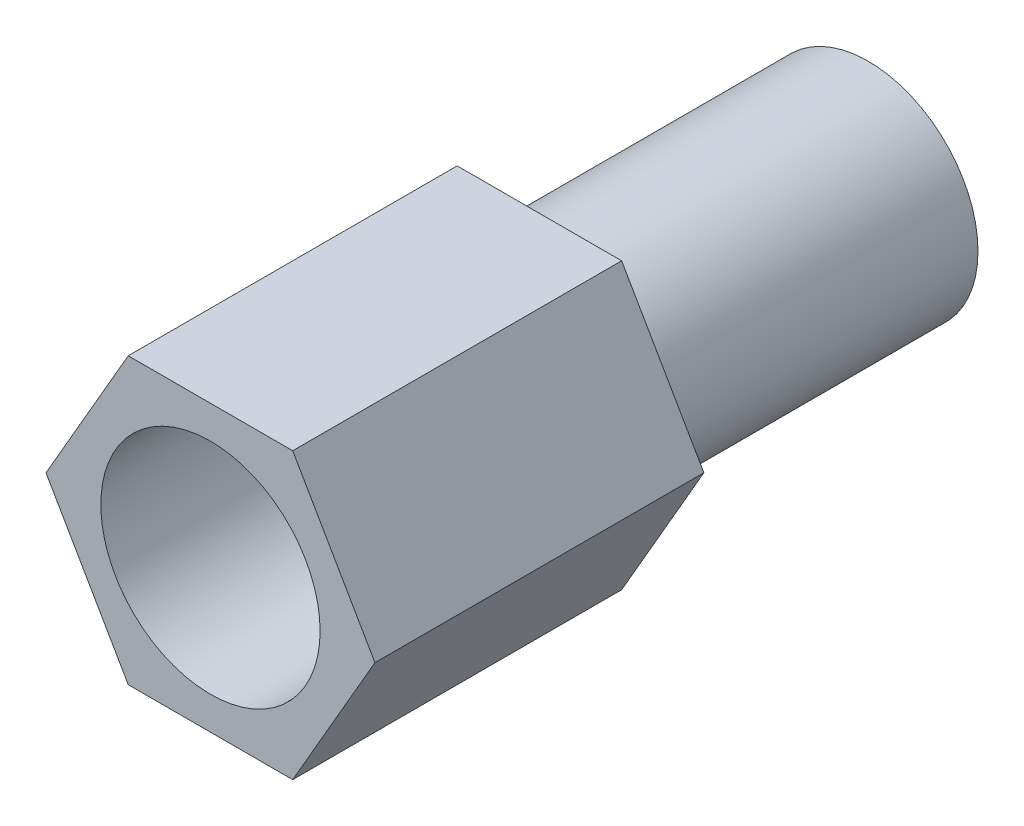
ISO-10303-21;
HEADER;
FILE_DESCRIPTION(('STEP AP214'),'2;1');
FILE_NAME('part.step','',(''),(''),'','','');
FILE_SCHEMA(('AUTOMOTIVE_DESIGN { 1 0 10303 214 1 1 1 1 }'));
ENDSEC;
DATA;
#1=APPLICATION_CONTEXT('core data for automotive mechanical design processes');
#2=APPLICATION_PROTOCOL_DEFINITION('international standard','automotive_design',2000,#1);
#3=PRODUCT_CONTEXT('',#1,'mechanical');
#4=PRODUCT('Part','Part','',(#3));
#5=PRODUCT_RELATED_PRODUCT_CATEGORY('part','',(#4));
#6=PRODUCT_DEFINITION_FORMATION('','',#4);
#7=PRODUCT_DEFINITION_CONTEXT('part definition',#1,'design');
#8=PRODUCT_DEFINITION('design','',#6,#7);
#9=PRODUCT_DEFINITION_SHAPE('','',#8);
#10=(LENGTH_UNIT() NAMED_UNIT(*) SI_UNIT(.MILLI.,.METRE.));
#11=(NAMED_UNIT(*) PLANE_ANGLE_UNIT() SI_UNIT($,.RADIAN.));
#12=(NAMED_UNIT(*) SI_UNIT($,.STERADIAN.) SOLID_ANGLE_UNIT());
#13=UNCERTAINTY_MEASURE_WITH_UNIT(LENGTH_MEASURE(1.E-05),#10,'distance_accuracy_value','');
#14=(GEOMETRIC_REPRESENTATION_CONTEXT(3) GLOBAL_UNCERTAINTY_ASSIGNED_CONTEXT((#13)) GLOBAL_UNIT_ASSIGNED_CONTEXT((#10,
#11,#12)) REPRESENTATION_CONTEXT('',''));
#15=CARTESIAN_POINT('',(0.,0.,0.));
#16=DIRECTION('',(0.,0.,1.));
#17=DIRECTION('',(1.,0.,0.));
#18=AXIS2_PLACEMENT_3D('',#15,#16,#17);
#19=CARTESIAN_POINT('',(0.,0.,-3.));
#20=DIRECTION('',(0.,0.,1.));
#21=DIRECTION('',(1.,0.,0.));
#22=AXIS2_PLACEMENT_3D('',#19,#20,#21);
#23=CYLINDRICAL_SURFACE('',#22,1.);
#24=CARTESIAN_POINT('',(0.,0.,-3.));
#25=DIRECTION('',(0.,0.,1.));
#26=DIRECTION('',(1.,0.,0.));
#27=AXIS2_PLACEMENT_3D('',#24,#25,#26);
#28=CIRCLE('',#27,1.);
#29=CARTESIAN_POINT('',(1.,0.,-3.));
#30=VERTEX_POINT('',#29);
#31=EDGE_CURVE('E11',#30,#30,#28,.T.);
#32=ORIENTED_EDGE('',*,*,#31,.T.);
#33=EDGE_LOOP('',(#32));
#34=FACE_BOUND('',#33,.T.);
#35=CARTESIAN_POINT('',(0.,0.,0.));
#36=DIRECTION('',(0.,0.,1.));
#37=DIRECTION('',(1.,0.,0.));
#38=AXIS2_PLACEMENT_3D('',#35,#36,#37);
#39=CIRCLE('',#38,1.);
#40=CARTESIAN_POINT('',(1.,0.,0.));
#41=VERTEX_POINT('',#40);
#42=EDGE_CURVE('E50',#41,#41,#39,.T.);
#43=ORIENTED_EDGE('',*,*,#42,.F.);
#44=EDGE_LOOP('',(#43));
#45=FACE_BOUND('',#44,.T.);
#46=ADVANCED_FACE('F47',(#34,#45),#23,.T.);
#47=CARTESIAN_POINT('',(0.,0.,-3.));
#48=DIRECTION('',(0.,0.,1.));
#49=DIRECTION('',(1.,0.,0.));
#50=AXIS2_PLACEMENT_3D('',#47,#48,#49);
#51=PLANE('',#50);
#52=ORIENTED_EDGE('',*,*,#31,.F.);
#53=EDGE_LOOP('',(#52));
#54=FACE_BOUND('',#53,.T.);
#55=ADVANCED_FACE('F64',(#54),#51,.F.);
#56=CARTESIAN_POINT('',(0.,0.,0.));
#57=DIRECTION('',(0.,0.,1.));
#58=DIRECTION('',(1.,0.,0.));
#59=AXIS2_PLACEMENT_3D('',#56,#57,#58);
#60=PLANE('',#59);
#61=ORIENTED_EDGE('',*,*,#42,.T.);
#62=EDGE_LOOP('',(#61));
#63=FACE_BOUND('',#62,.T.);
#64=ADVANCED_FACE('F61',(#63),#60,.T.);
#65=CLOSED_SHELL('',(#46,#55,#64));
#66=MANIFOLD_SOLID_BREP('B2',#65);
#67=CARTESIAN_POINT('',(0.,0.,3.));
#68=DIRECTION('',(0.,0.,1.));
#69=DIRECTION('',(1.,0.,0.));
#70=AXIS2_PLACEMENT_3D('',#67,#68,#69);
#71=PLANE('',#70);
#72=DIRECTION('',(-0.5,-0.866025403784439,0.));
#73=VECTOR('',#72,1.);
#74=CARTESIAN_POINT('',(-0.75,1.29903810567666,3.));
#75=LINE('',#74,#73);
#76=CARTESIAN_POINT('',(-0.75,1.29903810567666,3.));
#77=VERTEX_POINT('',#76);
#78=CARTESIAN_POINT('',(-1.5,0.,3.));
#79=VERTEX_POINT('',#78);
#80=EDGE_CURVE('E186',#77,#79,#75,.T.);
#81=ORIENTED_EDGE('',*,*,#80,.T.);
#82=DIRECTION('',(0.5,-0.866025403784439,0.));
#83=VECTOR('',#82,1.);
#84=CARTESIAN_POINT('',(-1.5,0.,3.));
#85=LINE('',#84,#83);
#86=CARTESIAN_POINT('',(-0.75,-1.29903810567666,3.));
#87=VERTEX_POINT('',#86);
#88=EDGE_CURVE('E144',#79,#87,#85,.T.);
#89=ORIENTED_EDGE('',*,*,#88,.T.);
#90=DIRECTION('',(1.,0.,0.));
#91=VECTOR('',#90,1.);
#92=CARTESIAN_POINT('',(-0.75,-1.29903810567666,3.));
#93=LINE('',#92,#91);
#94=CARTESIAN_POINT('',(0.75,-1.29903810567666,3.));
#95=VERTEX_POINT('',#94);
#96=EDGE_CURVE('E157',#87,#95,#93,.T.);
#97=ORIENTED_EDGE('',*,*,#96,.T.);
#98=DIRECTION('',(0.5,0.866025403784439,0.));
#99=VECTOR('',#98,1.);
#100=CARTESIAN_POINT('',(0.75,-1.29903810567666,3.));
#101=LINE('',#100,#99);
#102=CARTESIAN_POINT('',(1.5,0.,3.));
#103=VERTEX_POINT('',#102);
#104=EDGE_CURVE('E151',#95,#103,#101,.T.);
#105=ORIENTED_EDGE('',*,*,#104,.T.);
#106=DIRECTION('',(-0.5,0.866025403784439,0.));
#107=VECTOR('',#106,1.);
#108=CARTESIAN_POINT('',(1.5,0.,3.));
#109=LINE('',#108,#107);
#110=CARTESIAN_POINT('',(0.75,1.29903810567666,3.));
#111=VERTEX_POINT('',#110);
#112=EDGE_CURVE('E155',#103,#111,#109,.T.);
#113=ORIENTED_EDGE('',*,*,#112,.T.);
#114=DIRECTION('',(-1.,0.,0.));
#115=VECTOR('',#114,1.);
#116=CARTESIAN_POINT('',(0.75,1.29903810567666,3.));
#117=LINE('',#116,#115);
#118=EDGE_CURVE('E107',#111,#77,#117,.T.);
#119=ORIENTED_EDGE('',*,*,#118,.T.);
#120=EDGE_LOOP('',(#81,#89,#97,#105,#113,#119));
#121=FACE_BOUND('',#120,.T.);
#122=CARTESIAN_POINT('',(0.,0.,3.));
#123=DIRECTION('',(0.,0.,1.));
#124=DIRECTION('',(1.,0.,0.));
#125=AXIS2_PLACEMENT_3D('',#122,#123,#124);
#126=CIRCLE('',#125,1.);
#127=CARTESIAN_POINT('',(1.,0.,3.));
#128=VERTEX_POINT('',#127);
#129=EDGE_CURVE('E179',#128,#128,#126,.T.);
#130=ORIENTED_EDGE('',*,*,#129,.F.);
#131=EDGE_LOOP('',(#130));
#132=FACE_BOUND('',#131,.T.);
#133=ADVANCED_FACE('F90',(#121,#132),#71,.T.);
#134=CARTESIAN_POINT('',(0.,0.,0.));
#135=DIRECTION('',(0.,0.,1.));
#136=DIRECTION('',(1.,0.,0.));
#137=AXIS2_PLACEMENT_3D('',#134,#135,#136);
#138=PLANE('',#137);
#139=DIRECTION('',(-0.5,-0.866025403784439,0.));
#140=VECTOR('',#139,1.);
#141=CARTESIAN_POINT('',(-0.75,1.29903810567666,0.));
#142=LINE('',#141,#140);
#143=CARTESIAN_POINT('',(-0.75,1.29903810567666,0.));
#144=VERTEX_POINT('',#143);
#145=CARTESIAN_POINT('',(-1.5,0.,0.));
#146=VERTEX_POINT('',#145);
#147=EDGE_CURVE('E175',#144,#146,#142,.T.);
#148=ORIENTED_EDGE('',*,*,#147,.F.);
#149=DIRECTION('',(-1.,0.,0.));
#150=VECTOR('',#149,1.);
#151=CARTESIAN_POINT('',(0.75,1.29903810567666,0.));
#152=LINE('',#151,#150);
#153=CARTESIAN_POINT('',(0.75,1.29903810567666,0.));
#154=VERTEX_POINT('',#153);
#155=EDGE_CURVE('E136',#154,#144,#152,.T.);
#156=ORIENTED_EDGE('',*,*,#155,.F.);
#157=DIRECTION('',(-0.5,0.866025403784439,0.));
#158=VECTOR('',#157,1.);
#159=CARTESIAN_POINT('',(1.5,0.,0.));
#160=LINE('',#159,#158);
#161=CARTESIAN_POINT('',(1.5,0.,0.));
#162=VERTEX_POINT('',#161);
#163=EDGE_CURVE('E130',#162,#154,#160,.T.);
#164=ORIENTED_EDGE('',*,*,#163,.F.);
#165=DIRECTION('',(0.5,0.866025403784439,0.));
#166=VECTOR('',#165,1.);
#167=CARTESIAN_POINT('',(0.75,-1.29903810567666,0.));
#168=LINE('',#167,#166);
#169=CARTESIAN_POINT('',(0.75,-1.29903810567666,0.));
#170=VERTEX_POINT('',#169);
#171=EDGE_CURVE('E165',#170,#162,#168,.T.);
#172=ORIENTED_EDGE('',*,*,#171,.F.);
#173=DIRECTION('',(1.,0.,0.));
#174=VECTOR('',#173,1.);
#175=CARTESIAN_POINT('',(-0.75,-1.29903810567666,0.));
#176=LINE('',#175,#174);
#177=CARTESIAN_POINT('',(-0.75,-1.29903810567666,0.));
#178=VERTEX_POINT('',#177);
#179=EDGE_CURVE('E181',#178,#170,#176,.T.);
#180=ORIENTED_EDGE('',*,*,#179,.F.);
#181=DIRECTION('',(0.5,-0.866025403784439,0.));
#182=VECTOR('',#181,1.);
#183=CARTESIAN_POINT('',(-1.5,0.,0.));
#184=LINE('',#183,#182);
#185=EDGE_CURVE('E178',#146,#178,#184,.T.);
#186=ORIENTED_EDGE('',*,*,#185,.F.);
#187=EDGE_LOOP('',(#148,#156,#164,#172,#180,#186));
#188=FACE_BOUND('',#187,.T.);
#189=CARTESIAN_POINT('',(0.,0.,0.));
#190=DIRECTION('',(0.,0.,1.));
#191=DIRECTION('',(1.,0.,0.));
#192=AXIS2_PLACEMENT_3D('',#189,#190,#191);
#193=CIRCLE('',#192,1.);
#194=CARTESIAN_POINT('',(1.,0.,0.));
#195=VERTEX_POINT('',#194);
#196=EDGE_CURVE('E279',#195,#195,#193,.T.);
#197=ORIENTED_EDGE('',*,*,#196,.T.);
#198=EDGE_LOOP('',(#197));
#199=FACE_BOUND('',#198,.T.);
#200=ADVANCED_FACE('F195',(#188,#199),#138,.F.);
#201=CARTESIAN_POINT('',(-0.75,1.29903810567666,3.));
#202=DIRECTION('',(0.866025403784439,-0.5,0.));
#203=DIRECTION('',(0.5,0.866025403784439,0.));
#204=AXIS2_PLACEMENT_3D('',#201,#202,#203);
#205=PLANE('',#204);
#206=ORIENTED_EDGE('',*,*,#147,.T.);
#207=DIRECTION('',(0.,0.,-1.));
#208=VECTOR('',#207,1.);
#209=CARTESIAN_POINT('',(-1.5,0.,3.));
#210=LINE('',#209,#208);
#211=EDGE_CURVE('E45',#79,#146,#210,.T.);
#212=ORIENTED_EDGE('',*,*,#211,.F.);
#213=ORIENTED_EDGE('',*,*,#80,.F.);
#214=DIRECTION('',(0.,0.,-1.));
#215=VECTOR('',#214,1.);
#216=CARTESIAN_POINT('',(-0.75,1.29903810567666,3.));
#217=LINE('',#216,#215);
#218=EDGE_CURVE('E171',#77,#144,#217,.T.);
#219=ORIENTED_EDGE('',*,*,#218,.T.);
#220=EDGE_LOOP('',(#206,#212,#213,#219));
#221=FACE_BOUND('',#220,.T.);
#222=ADVANCED_FACE('F92',(#221),#205,.F.);
#223=CARTESIAN_POINT('',(-1.5,0.,3.));
#224=DIRECTION('',(0.866025403784438,0.5,0.));
#225=DIRECTION('',(-0.5,0.866025403784439,0.));
#226=AXIS2_PLACEMENT_3D('',#223,#224,#225);
#227=PLANE('',#226);
#228=ORIENTED_EDGE('',*,*,#185,.T.);
#229=DIRECTION('',(0.,0.,-1.));
#230=VECTOR('',#229,1.);
#231=CARTESIAN_POINT('',(-0.75,-1.29903810567666,3.));
#232=LINE('',#231,#230);
#233=EDGE_CURVE('E99',#87,#178,#232,.T.);
#234=ORIENTED_EDGE('',*,*,#233,.F.);
#235=ORIENTED_EDGE('',*,*,#88,.F.);
#236=ORIENTED_EDGE('',*,*,#211,.T.);
#237=EDGE_LOOP('',(#228,#234,#235,#236));
#238=FACE_BOUND('',#237,.T.);
#239=ADVANCED_FACE('F220',(#238),#227,.F.);
#240=CARTESIAN_POINT('',(-0.75,-1.29903810567666,3.));
#241=DIRECTION('',(0.,1.,0.));
#242=DIRECTION('',(-1.,0.,0.));
#243=AXIS2_PLACEMENT_3D('',#240,#241,#242);
#244=PLANE('',#243);
#245=ORIENTED_EDGE('',*,*,#179,.T.);
#246=DIRECTION('',(0.,0.,-1.));
#247=VECTOR('',#246,1.);
#248=CARTESIAN_POINT('',(0.75,-1.29903810567666,3.));
#249=LINE('',#248,#247);
#250=EDGE_CURVE('E166',#95,#170,#249,.T.);
#251=ORIENTED_EDGE('',*,*,#250,.F.);
#252=ORIENTED_EDGE('',*,*,#96,.F.);
#253=ORIENTED_EDGE('',*,*,#233,.T.);
#254=EDGE_LOOP('',(#245,#251,#252,#253));
#255=FACE_BOUND('',#254,.T.);
#256=ADVANCED_FACE('F192',(#255),#244,.F.);
#257=CARTESIAN_POINT('',(0.75,-1.29903810567666,3.));
#258=DIRECTION('',(-0.866025403784439,0.499999999999999,0.));
#259=DIRECTION('',(-0.5,-0.866025403784439,0.));
#260=AXIS2_PLACEMENT_3D('',#257,#258,#259);
#261=PLANE('',#260);
#262=ORIENTED_EDGE('',*,*,#171,.T.);
#263=DIRECTION('',(0.,0.,-1.));
#264=VECTOR('',#263,1.);
#265=CARTESIAN_POINT('',(1.5,0.,3.));
#266=LINE('',#265,#264);
#267=EDGE_CURVE('E162',#103,#162,#266,.T.);
#268=ORIENTED_EDGE('',*,*,#267,.F.);
#269=ORIENTED_EDGE('',*,*,#104,.F.);
#270=ORIENTED_EDGE('',*,*,#250,.T.);
#271=EDGE_LOOP('',(#262,#268,#269,#270));
#272=FACE_BOUND('',#271,.T.);
#273=ADVANCED_FACE('F163',(#272),#261,.F.);
#274=CARTESIAN_POINT('',(1.5,0.,3.));
#275=DIRECTION('',(-0.866025403784438,-0.5,0.));
#276=DIRECTION('',(0.5,-0.866025403784439,0.));
#277=AXIS2_PLACEMENT_3D('',#274,#275,#276);
#278=PLANE('',#277);
#279=ORIENTED_EDGE('',*,*,#163,.T.);
#280=DIRECTION('',(0.,0.,-1.));
#281=VECTOR('',#280,1.);
#282=CARTESIAN_POINT('',(0.75,1.29903810567666,3.));
#283=LINE('',#282,#281);
#284=EDGE_CURVE('E167',#111,#154,#283,.T.);
#285=ORIENTED_EDGE('',*,*,#284,.F.);
#286=ORIENTED_EDGE('',*,*,#112,.F.);
#287=ORIENTED_EDGE('',*,*,#267,.T.);
#288=EDGE_LOOP('',(#279,#285,#286,#287));
#289=FACE_BOUND('',#288,.T.);
#290=ADVANCED_FACE('F169',(#289),#278,.F.);
#291=CARTESIAN_POINT('',(0.75,1.29903810567666,3.));
#292=DIRECTION('',(0.,-1.,0.));
#293=DIRECTION('',(0.,0.,-1.));
#294=AXIS2_PLACEMENT_3D('',#291,#292,#293);
#295=PLANE('',#294);
#296=ORIENTED_EDGE('',*,*,#155,.T.);
#297=ORIENTED_EDGE('',*,*,#218,.F.);
#298=ORIENTED_EDGE('',*,*,#118,.F.);
#299=ORIENTED_EDGE('',*,*,#284,.T.);
#300=EDGE_LOOP('',(#296,#297,#298,#299));
#301=FACE_BOUND('',#300,.T.);
#302=ADVANCED_FACE('F200',(#301),#295,.F.);
#303=CARTESIAN_POINT('',(0.,0.,3.));
#304=DIRECTION('',(0.,0.,-1.));
#305=DIRECTION('',(-1.,0.,0.));
#306=AXIS2_PLACEMENT_3D('',#303,#304,#305);
#307=CYLINDRICAL_SURFACE('',#306,1.);
#308=ORIENTED_EDGE('',*,*,#129,.T.);
#309=EDGE_LOOP('',(#308));
#310=FACE_BOUND('',#309,.T.);
#311=ORIENTED_EDGE('',*,*,#196,.F.);
#312=EDGE_LOOP('',(#311));
#313=FACE_BOUND('',#312,.T.);
#314=ADVANCED_FACE('F202',(#310,#313),#307,.F.);
#315=CLOSED_SHELL('',(#133,#200,#222,#239,#256,#273,#290,#302,#314));
#316=MANIFOLD_SOLID_BREP('B6',#315);
#317=ADVANCED_BREP_SHAPE_REPRESENTATION('',(#18,#66,#316),#14);
#318=SHAPE_DEFINITION_REPRESENTATION(#9,#317);
ENDSEC;
END-ISO-10303-21;
